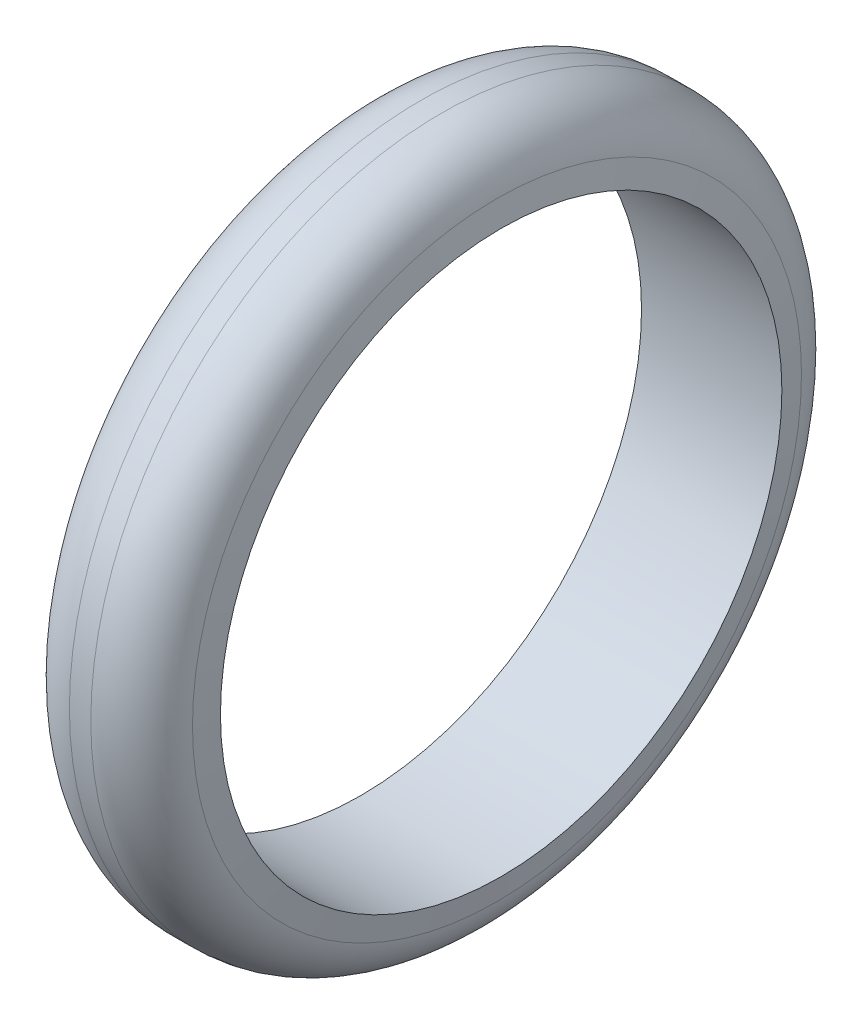
ISO-10303-21;
HEADER;
FILE_DESCRIPTION(('STEP AP214'),'2;1');
FILE_NAME('part.step','',(''),(''),'','','');
FILE_SCHEMA(('AUTOMOTIVE_DESIGN { 1 0 10303 214 1 1 1 1 }'));
ENDSEC;
DATA;
#1=APPLICATION_CONTEXT('core data for automotive mechanical design processes');
#2=APPLICATION_PROTOCOL_DEFINITION('international standard','automotive_design',2000,#1);
#3=PRODUCT_CONTEXT('',#1,'mechanical');
#4=PRODUCT('Part','Part','',(#3));
#5=PRODUCT_RELATED_PRODUCT_CATEGORY('part','',(#4));
#6=PRODUCT_DEFINITION_FORMATION('','',#4);
#7=PRODUCT_DEFINITION_CONTEXT('part definition',#1,'design');
#8=PRODUCT_DEFINITION('design','',#6,#7);
#9=PRODUCT_DEFINITION_SHAPE('','',#8);
#10=(LENGTH_UNIT() NAMED_UNIT(*) SI_UNIT(.MILLI.,.METRE.));
#11=(NAMED_UNIT(*) PLANE_ANGLE_UNIT() SI_UNIT($,.RADIAN.));
#12=(NAMED_UNIT(*) SI_UNIT($,.STERADIAN.) SOLID_ANGLE_UNIT());
#13=UNCERTAINTY_MEASURE_WITH_UNIT(LENGTH_MEASURE(1.E-05),#10,'distance_accuracy_value','');
#14=(GEOMETRIC_REPRESENTATION_CONTEXT(3) GLOBAL_UNCERTAINTY_ASSIGNED_CONTEXT((#13)) GLOBAL_UNIT_ASSIGNED_CONTEXT((#10,
#11,#12)) REPRESENTATION_CONTEXT('',''));
#15=CARTESIAN_POINT('',(0.,0.,0.));
#16=DIRECTION('',(0.,0.,1.));
#17=DIRECTION('',(1.,0.,0.));
#18=AXIS2_PLACEMENT_3D('',#15,#16,#17);
#19=CARTESIAN_POINT('',(-8.23673019291543,0.,0.));
#20=DIRECTION('',(1.,0.,0.));
#21=DIRECTION('',(0.,0.,-1.));
#22=AXIS2_PLACEMENT_3D('',#19,#20,#21);
#23=CONICAL_SURFACE('',#22,50.,1.39626340159547);
#24=CARTESIAN_POINT('',(-9.40239516759481,0.,0.));
#25=DIRECTION('',(-1.,0.,0.));
#26=DIRECTION('',(0.,0.,1.));
#27=AXIS2_PLACEMENT_3D('',#24,#25,#26);
#28=CIRCLE('',#27,43.3891854213354);
#29=CARTESIAN_POINT('',(-9.40239516759481,0.,43.3891854213354));
#30=VERTEX_POINT('',#29);
#31=EDGE_CURVE('E10',#30,#30,#28,.T.);
#32=ORIENTED_EDGE('',*,*,#31,.T.);
#33=EDGE_LOOP('',(#32));
#34=FACE_BOUND('',#33,.T.);
#35=CARTESIAN_POINT('',(-10.,0.,0.));
#36=DIRECTION('',(-1.,0.,0.));
#37=DIRECTION('',(0.,0.,1.));
#38=AXIS2_PLACEMENT_3D('',#35,#36,#37);
#39=CIRCLE('',#38,40.);
#40=CARTESIAN_POINT('',(-10.,0.,40.));
#41=VERTEX_POINT('',#40);
#42=EDGE_CURVE('E54',#41,#41,#39,.T.);
#43=ORIENTED_EDGE('',*,*,#42,.F.);
#44=EDGE_LOOP('',(#43));
#45=FACE_BOUND('',#44,.T.);
#46=ADVANCED_FACE('F34',(#34,#45),#23,.T.);
#47=CARTESIAN_POINT('',(0.,0.,0.));
#48=DIRECTION('',(-1.,0.,0.));
#49=DIRECTION('',(0.,0.,1.));
#50=AXIS2_PLACEMENT_3D('',#47,#48,#49);
#51=CYLINDRICAL_SURFACE('',#50,40.);
#52=CARTESIAN_POINT('',(10.,0.,0.));
#53=DIRECTION('',(-1.,0.,0.));
#54=DIRECTION('',(0.,0.,1.));
#55=AXIS2_PLACEMENT_3D('',#52,#53,#54);
#56=CIRCLE('',#55,40.);
#57=CARTESIAN_POINT('',(10.,0.,40.));
#58=VERTEX_POINT('',#57);
#59=EDGE_CURVE('E57',#58,#58,#56,.T.);
#60=ORIENTED_EDGE('',*,*,#59,.F.);
#61=EDGE_LOOP('',(#60));
#62=FACE_BOUND('',#61,.T.);
#63=ORIENTED_EDGE('',*,*,#42,.T.);
#64=EDGE_LOOP('',(#63));
#65=FACE_BOUND('',#64,.T.);
#66=ADVANCED_FACE('F63',(#62,#65),#51,.F.);
#67=CARTESIAN_POINT('',(10.,0.,0.));
#68=DIRECTION('',(-1.,0.,0.));
#69=DIRECTION('',(0.,0.,1.));
#70=AXIS2_PLACEMENT_3D('',#67,#68,#69);
#71=CONICAL_SURFACE('',#70,40.,1.39626340159547);
#72=CARTESIAN_POINT('',(9.40239516759481,0.,0.));
#73=DIRECTION('',(1.,0.,0.));
#74=DIRECTION('',(0.,0.,-1.));
#75=AXIS2_PLACEMENT_3D('',#72,#73,#74);
#76=CIRCLE('',#75,43.3891854213354);
#77=CARTESIAN_POINT('',(9.40239516759481,0.,-43.3891854213354));
#78=VERTEX_POINT('',#77);
#79=EDGE_CURVE('E41',#78,#78,#76,.T.);
#80=ORIENTED_EDGE('',*,*,#79,.T.);
#81=EDGE_LOOP('',(#80));
#82=FACE_BOUND('',#81,.T.);
#83=ORIENTED_EDGE('',*,*,#59,.T.);
#84=EDGE_LOOP('',(#83));
#85=FACE_BOUND('',#84,.T.);
#86=ADVANCED_FACE('F61',(#82,#85),#71,.T.);
#87=CARTESIAN_POINT('',(0.,0.,0.));
#88=DIRECTION('',(-1.,0.,0.));
#89=DIRECTION('',(0.,0.,1.));
#90=AXIS2_PLACEMENT_3D('',#87,#88,#89);
#91=CYLINDRICAL_SURFACE('',#90,50.);
#92=CARTESIAN_POINT('',(1.52393314349714,0.,0.));
#93=DIRECTION('',(1.,0.,0.));
#94=DIRECTION('',(0.,0.,-1.));
#95=AXIS2_PLACEMENT_3D('',#92,#93,#94);
#96=CIRCLE('',#95,50.);
#97=CARTESIAN_POINT('',(1.52393314349714,0.,-50.));
#98=VERTEX_POINT('',#97);
#99=EDGE_CURVE('E45',#98,#98,#96,.F.);
#100=ORIENTED_EDGE('',*,*,#99,.T.);
#101=EDGE_LOOP('',(#100));
#102=FACE_BOUND('',#101,.T.);
#103=CARTESIAN_POINT('',(-1.52393314349714,0.,0.));
#104=DIRECTION('',(1.,0.,0.));
#105=DIRECTION('',(0.,0.,-1.));
#106=AXIS2_PLACEMENT_3D('',#103,#104,#105);
#107=CIRCLE('',#106,50.);
#108=CARTESIAN_POINT('',(-1.52393314349714,0.,-50.));
#109=VERTEX_POINT('',#108);
#110=EDGE_CURVE('E49',#109,#109,#107,.T.);
#111=ORIENTED_EDGE('',*,*,#110,.T.);
#112=EDGE_LOOP('',(#111));
#113=FACE_BOUND('',#112,.T.);
#114=ADVANCED_FACE('F76',(#102,#113),#91,.T.);
#115=CARTESIAN_POINT('',(1.52393314349714,0.,0.));
#116=DIRECTION('',(1.,0.,0.));
#117=DIRECTION('',(0.,0.,-1.));
#118=AXIS2_PLACEMENT_3D('',#115,#116,#117);
#119=TOROIDAL_SURFACE('',#118,42.,8.);
#120=ORIENTED_EDGE('',*,*,#79,.F.);
#121=EDGE_LOOP('',(#120));
#122=FACE_BOUND('',#121,.T.);
#123=ORIENTED_EDGE('',*,*,#99,.F.);
#124=EDGE_LOOP('',(#123));
#125=FACE_BOUND('',#124,.T.);
#126=ADVANCED_FACE('F74',(#122,#125),#119,.T.);
#127=CARTESIAN_POINT('',(-1.52393314349714,0.,0.));
#128=DIRECTION('',(1.,0.,0.));
#129=DIRECTION('',(0.,0.,-1.));
#130=AXIS2_PLACEMENT_3D('',#127,#128,#129);
#131=TOROIDAL_SURFACE('',#130,42.,8.);
#132=ORIENTED_EDGE('',*,*,#110,.F.);
#133=EDGE_LOOP('',(#132));
#134=FACE_BOUND('',#133,.T.);
#135=ORIENTED_EDGE('',*,*,#31,.F.);
#136=EDGE_LOOP('',(#135));
#137=FACE_BOUND('',#136,.T.);
#138=ADVANCED_FACE('F36',(#134,#137),#131,.T.);
#139=CLOSED_SHELL('',(#46,#66,#86,#114,#126,#138));
#140=MANIFOLD_SOLID_BREP('B2',#139);
#141=ADVANCED_BREP_SHAPE_REPRESENTATION('',(#18,#140),#14);
#142=SHAPE_DEFINITION_REPRESENTATION(#9,#141);
ENDSEC;
END-ISO-10303-21;
